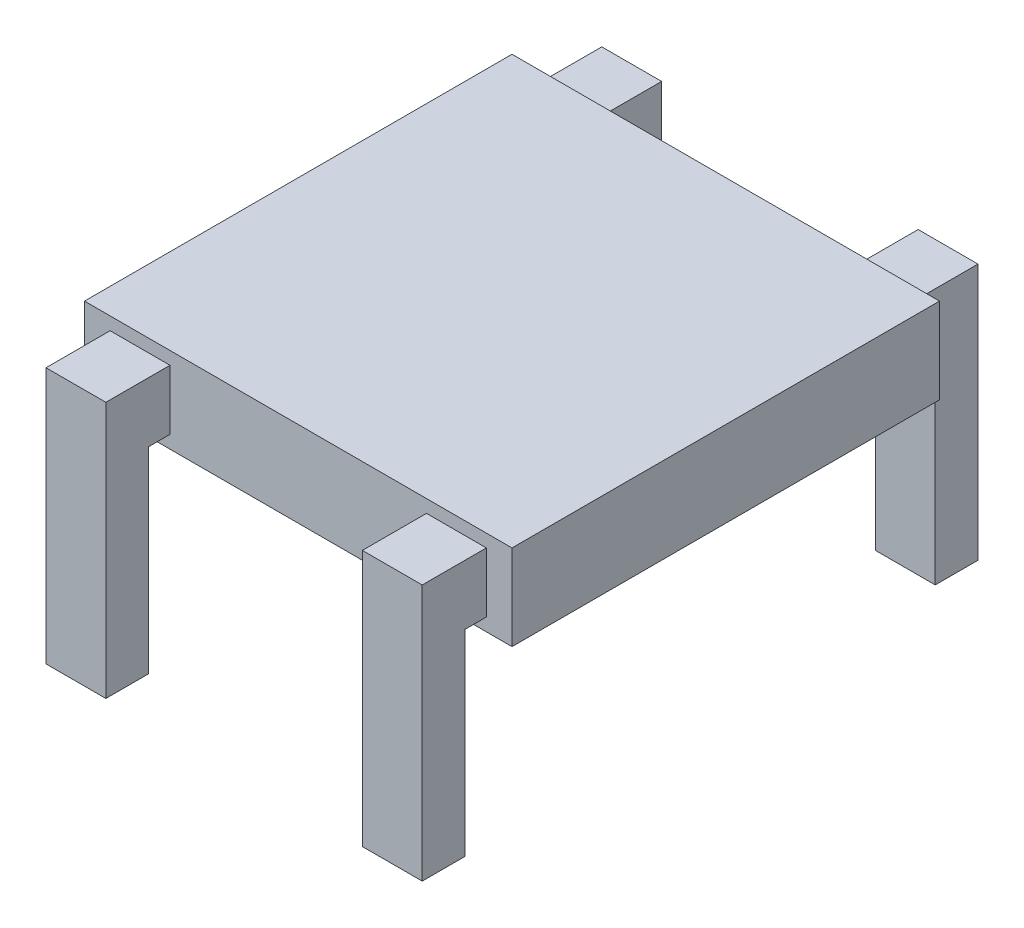
ISO-10303-21;
HEADER;
FILE_DESCRIPTION(('STEP AP214'),'2;1');
FILE_NAME('part.step','',(''),(''),'','','');
FILE_SCHEMA(('AUTOMOTIVE_DESIGN { 1 0 10303 214 1 1 1 1 }'));
ENDSEC;
DATA;
#1=APPLICATION_CONTEXT('core data for automotive mechanical design processes');
#2=APPLICATION_PROTOCOL_DEFINITION('international standard','automotive_design',2000,#1);
#3=PRODUCT_CONTEXT('',#1,'mechanical');
#4=PRODUCT('Part','Part','',(#3));
#5=PRODUCT_RELATED_PRODUCT_CATEGORY('part','',(#4));
#6=PRODUCT_DEFINITION_FORMATION('','',#4);
#7=PRODUCT_DEFINITION_CONTEXT('part definition',#1,'design');
#8=PRODUCT_DEFINITION('design','',#6,#7);
#9=PRODUCT_DEFINITION_SHAPE('','',#8);
#10=(LENGTH_UNIT() NAMED_UNIT(*) SI_UNIT(.MILLI.,.METRE.));
#11=(NAMED_UNIT(*) PLANE_ANGLE_UNIT() SI_UNIT($,.RADIAN.));
#12=(NAMED_UNIT(*) SI_UNIT($,.STERADIAN.) SOLID_ANGLE_UNIT());
#13=UNCERTAINTY_MEASURE_WITH_UNIT(LENGTH_MEASURE(1.E-05),#10,'distance_accuracy_value','');
#14=(GEOMETRIC_REPRESENTATION_CONTEXT(3) GLOBAL_UNCERTAINTY_ASSIGNED_CONTEXT((#13)) GLOBAL_UNIT_ASSIGNED_CONTEXT((#10,
#11,#12)) REPRESENTATION_CONTEXT('',''));
#15=CARTESIAN_POINT('',(0.,0.,0.));
#16=DIRECTION('',(0.,0.,1.));
#17=DIRECTION('',(1.,0.,0.));
#18=AXIS2_PLACEMENT_3D('',#15,#16,#17);
#19=CARTESIAN_POINT('',(2.5,1.,-2.5));
#20=DIRECTION('',(0.,0.,1.));
#21=DIRECTION('',(1.,0.,0.));
#22=AXIS2_PLACEMENT_3D('',#19,#20,#21);
#23=PLANE('',#22);
#24=DIRECTION('',(0.,-1.,0.));
#25=VECTOR('',#24,1.);
#26=CARTESIAN_POINT('',(2.2,0.15,-2.5));
#27=LINE('',#26,#25);
#28=CARTESIAN_POINT('',(2.2,0.85,-2.5));
#29=VERTEX_POINT('',#28);
#30=CARTESIAN_POINT('',(2.2,0.15,-2.5));
#31=VERTEX_POINT('',#30);
#32=EDGE_CURVE('E301',#29,#31,#27,.T.);
#33=ORIENTED_EDGE('',*,*,#32,.F.);
#34=DIRECTION('',(1.,0.,0.));
#35=VECTOR('',#34,1.);
#36=CARTESIAN_POINT('',(1.5,0.85,-2.5));
#37=LINE('',#36,#35);
#38=CARTESIAN_POINT('',(1.5,0.85,-2.5));
#39=VERTEX_POINT('',#38);
#40=EDGE_CURVE('E309',#39,#29,#37,.T.);
#41=ORIENTED_EDGE('',*,*,#40,.F.);
#42=DIRECTION('',(0.,1.,0.));
#43=VECTOR('',#42,1.);
#44=CARTESIAN_POINT('',(1.5,0.15,-2.5));
#45=LINE('',#44,#43);
#46=CARTESIAN_POINT('',(1.5,0.15,-2.5));
#47=VERTEX_POINT('',#46);
#48=EDGE_CURVE('E306',#47,#39,#45,.T.);
#49=ORIENTED_EDGE('',*,*,#48,.F.);
#50=DIRECTION('',(-1.,0.,0.));
#51=VECTOR('',#50,1.);
#52=CARTESIAN_POINT('',(1.5,0.15,-2.5));
#53=LINE('',#52,#51);
#54=EDGE_CURVE('E304',#31,#47,#53,.T.);
#55=ORIENTED_EDGE('',*,*,#54,.F.);
#56=EDGE_LOOP('',(#33,#41,#49,#55));
#57=FACE_BOUND('',#56,.T.);
#58=DIRECTION('',(-1.,0.,0.));
#59=VECTOR('',#58,1.);
#60=CARTESIAN_POINT('',(2.5,0.,-2.5));
#61=LINE('',#60,#59);
#62=CARTESIAN_POINT('',(2.5,0.,-2.5));
#63=VERTEX_POINT('',#62);
#64=CARTESIAN_POINT('',(-2.5,0.,-2.5));
#65=VERTEX_POINT('',#64);
#66=EDGE_CURVE('E422',#63,#65,#61,.T.);
#67=ORIENTED_EDGE('',*,*,#66,.T.);
#68=DIRECTION('',(0.,-1.,0.));
#69=VECTOR('',#68,1.);
#70=CARTESIAN_POINT('',(-2.5,1.,-2.5));
#71=LINE('',#70,#69);
#72=CARTESIAN_POINT('',(-2.5,1.,-2.5));
#73=VERTEX_POINT('',#72);
#74=EDGE_CURVE('E428',#73,#65,#71,.T.);
#75=ORIENTED_EDGE('',*,*,#74,.F.);
#76=DIRECTION('',(-1.,0.,0.));
#77=VECTOR('',#76,1.);
#78=CARTESIAN_POINT('',(2.5,1.,-2.5));
#79=LINE('',#78,#77);
#80=CARTESIAN_POINT('',(2.5,1.,-2.5));
#81=VERTEX_POINT('',#80);
#82=EDGE_CURVE('E426',#81,#73,#79,.T.);
#83=ORIENTED_EDGE('',*,*,#82,.F.);
#84=DIRECTION('',(0.,-1.,0.));
#85=VECTOR('',#84,1.);
#86=CARTESIAN_POINT('',(2.5,1.,-2.5));
#87=LINE('',#86,#85);
#88=EDGE_CURVE('E438',#81,#63,#87,.T.);
#89=ORIENTED_EDGE('',*,*,#88,.T.);
#90=EDGE_LOOP('',(#67,#75,#83,#89));
#91=FACE_BOUND('',#90,.T.);
#92=DIRECTION('',(-1.,0.,0.));
#93=VECTOR('',#92,1.);
#94=CARTESIAN_POINT('',(-1.5,0.15,-2.5));
#95=LINE('',#94,#93);
#96=CARTESIAN_POINT('',(-1.5,0.15,-2.5));
#97=VERTEX_POINT('',#96);
#98=CARTESIAN_POINT('',(-2.2,0.15,-2.5));
#99=VERTEX_POINT('',#98);
#100=EDGE_CURVE('E281',#97,#99,#95,.T.);
#101=ORIENTED_EDGE('',*,*,#100,.F.);
#102=DIRECTION('',(0.,-1.,0.));
#103=VECTOR('',#102,1.);
#104=CARTESIAN_POINT('',(-1.5,0.15,-2.5));
#105=LINE('',#104,#103);
#106=CARTESIAN_POINT('',(-1.5,0.85,-2.5));
#107=VERTEX_POINT('',#106);
#108=EDGE_CURVE('E290',#107,#97,#105,.T.);
#109=ORIENTED_EDGE('',*,*,#108,.F.);
#110=DIRECTION('',(1.,0.,0.));
#111=VECTOR('',#110,1.);
#112=CARTESIAN_POINT('',(-1.5,0.85,-2.5));
#113=LINE('',#112,#111);
#114=CARTESIAN_POINT('',(-2.2,0.85,-2.5));
#115=VERTEX_POINT('',#114);
#116=EDGE_CURVE('E287',#115,#107,#113,.T.);
#117=ORIENTED_EDGE('',*,*,#116,.F.);
#118=DIRECTION('',(0.,1.,0.));
#119=VECTOR('',#118,1.);
#120=CARTESIAN_POINT('',(-2.2,0.15,-2.5));
#121=LINE('',#120,#119);
#122=EDGE_CURVE('E284',#99,#115,#121,.T.);
#123=ORIENTED_EDGE('',*,*,#122,.F.);
#124=EDGE_LOOP('',(#101,#109,#117,#123));
#125=FACE_BOUND('',#124,.T.);
#126=ADVANCED_FACE('F33',(#57,#91,#125),#23,.F.);
#127=CARTESIAN_POINT('',(2.5,1.,2.5));
#128=DIRECTION('',(0.,0.,-1.));
#129=DIRECTION('',(-1.,0.,0.));
#130=AXIS2_PLACEMENT_3D('',#127,#128,#129);
#131=PLANE('',#130);
#132=DIRECTION('',(0.,-1.,0.));
#133=VECTOR('',#132,1.);
#134=CARTESIAN_POINT('',(-2.2,0.15,2.5));
#135=LINE('',#134,#133);
#136=CARTESIAN_POINT('',(-2.2,0.85,2.5));
#137=VERTEX_POINT('',#136);
#138=CARTESIAN_POINT('',(-2.2,0.15,2.5));
#139=VERTEX_POINT('',#138);
#140=EDGE_CURVE('E397',#137,#139,#135,.T.);
#141=ORIENTED_EDGE('',*,*,#140,.F.);
#142=DIRECTION('',(-1.,0.,0.));
#143=VECTOR('',#142,1.);
#144=CARTESIAN_POINT('',(-1.5,0.85,2.5));
#145=LINE('',#144,#143);
#146=CARTESIAN_POINT('',(-1.5,0.85,2.5));
#147=VERTEX_POINT('',#146);
#148=EDGE_CURVE('E406',#147,#137,#145,.T.);
#149=ORIENTED_EDGE('',*,*,#148,.F.);
#150=DIRECTION('',(0.,1.,0.));
#151=VECTOR('',#150,1.);
#152=CARTESIAN_POINT('',(-1.5,0.15,2.5));
#153=LINE('',#152,#151);
#154=CARTESIAN_POINT('',(-1.5,0.15,2.5));
#155=VERTEX_POINT('',#154);
#156=EDGE_CURVE('E403',#155,#147,#153,.T.);
#157=ORIENTED_EDGE('',*,*,#156,.F.);
#158=DIRECTION('',(1.,0.,0.));
#159=VECTOR('',#158,1.);
#160=CARTESIAN_POINT('',(-1.5,0.15,2.5));
#161=LINE('',#160,#159);
#162=EDGE_CURVE('E400',#139,#155,#161,.T.);
#163=ORIENTED_EDGE('',*,*,#162,.F.);
#164=EDGE_LOOP('',(#141,#149,#157,#163));
#165=FACE_BOUND('',#164,.T.);
#166=DIRECTION('',(1.,0.,0.));
#167=VECTOR('',#166,1.);
#168=CARTESIAN_POINT('',(2.5,0.,2.5));
#169=LINE('',#168,#167);
#170=CARTESIAN_POINT('',(-2.5,0.,2.5));
#171=VERTEX_POINT('',#170);
#172=CARTESIAN_POINT('',(2.5,0.,2.5));
#173=VERTEX_POINT('',#172);
#174=EDGE_CURVE('E431',#171,#173,#169,.T.);
#175=ORIENTED_EDGE('',*,*,#174,.T.);
#176=DIRECTION('',(0.,-1.,0.));
#177=VECTOR('',#176,1.);
#178=CARTESIAN_POINT('',(2.5,1.,2.5));
#179=LINE('',#178,#177);
#180=CARTESIAN_POINT('',(2.5,1.,2.5));
#181=VERTEX_POINT('',#180);
#182=EDGE_CURVE('E41',#181,#173,#179,.T.);
#183=ORIENTED_EDGE('',*,*,#182,.F.);
#184=DIRECTION('',(1.,0.,0.));
#185=VECTOR('',#184,1.);
#186=CARTESIAN_POINT('',(2.5,1.,2.5));
#187=LINE('',#186,#185);
#188=CARTESIAN_POINT('',(-2.5,1.,2.5));
#189=VERTEX_POINT('',#188);
#190=EDGE_CURVE('E421',#189,#181,#187,.T.);
#191=ORIENTED_EDGE('',*,*,#190,.F.);
#192=DIRECTION('',(0.,-1.,0.));
#193=VECTOR('',#192,1.);
#194=CARTESIAN_POINT('',(-2.5,1.,2.5));
#195=LINE('',#194,#193);
#196=EDGE_CURVE('E11',#189,#171,#195,.T.);
#197=ORIENTED_EDGE('',*,*,#196,.T.);
#198=EDGE_LOOP('',(#175,#183,#191,#197));
#199=FACE_BOUND('',#198,.T.);
#200=DIRECTION('',(1.,0.,0.));
#201=VECTOR('',#200,1.);
#202=CARTESIAN_POINT('',(1.5,0.15,2.5));
#203=LINE('',#202,#201);
#204=CARTESIAN_POINT('',(1.5,0.15,2.5));
#205=VERTEX_POINT('',#204);
#206=CARTESIAN_POINT('',(2.2,0.15,2.5));
#207=VERTEX_POINT('',#206);
#208=EDGE_CURVE('E377',#205,#207,#203,.T.);
#209=ORIENTED_EDGE('',*,*,#208,.F.);
#210=DIRECTION('',(0.,-1.,0.));
#211=VECTOR('',#210,1.);
#212=CARTESIAN_POINT('',(1.5,0.15,2.5));
#213=LINE('',#212,#211);
#214=CARTESIAN_POINT('',(1.5,0.85,2.5));
#215=VERTEX_POINT('',#214);
#216=EDGE_CURVE('E386',#215,#205,#213,.T.);
#217=ORIENTED_EDGE('',*,*,#216,.F.);
#218=DIRECTION('',(-1.,0.,0.));
#219=VECTOR('',#218,1.);
#220=CARTESIAN_POINT('',(1.5,0.85,2.5));
#221=LINE('',#220,#219);
#222=CARTESIAN_POINT('',(2.2,0.85,2.5));
#223=VERTEX_POINT('',#222);
#224=EDGE_CURVE('E383',#223,#215,#221,.T.);
#225=ORIENTED_EDGE('',*,*,#224,.F.);
#226=DIRECTION('',(0.,1.,0.));
#227=VECTOR('',#226,1.);
#228=CARTESIAN_POINT('',(2.2,0.15,2.5));
#229=LINE('',#228,#227);
#230=EDGE_CURVE('E380',#207,#223,#229,.T.);
#231=ORIENTED_EDGE('',*,*,#230,.F.);
#232=EDGE_LOOP('',(#209,#217,#225,#231));
#233=FACE_BOUND('',#232,.T.);
#234=ADVANCED_FACE('F461',(#165,#199,#233),#131,.F.);
#235=CARTESIAN_POINT('',(-2.5,1.,2.5));
#236=DIRECTION('',(1.,0.,0.));
#237=DIRECTION('',(0.,0.,-1.));
#238=AXIS2_PLACEMENT_3D('',#235,#236,#237);
#239=PLANE('',#238);
#240=DIRECTION('',(0.,0.,1.));
#241=VECTOR('',#240,1.);
#242=CARTESIAN_POINT('',(-2.5,0.,2.5));
#243=LINE('',#242,#241);
#244=EDGE_CURVE('E417',#65,#171,#243,.T.);
#245=ORIENTED_EDGE('',*,*,#244,.T.);
#246=ORIENTED_EDGE('',*,*,#196,.F.);
#247=DIRECTION('',(0.,0.,1.));
#248=VECTOR('',#247,1.);
#249=CARTESIAN_POINT('',(-2.5,1.,2.5));
#250=LINE('',#249,#248);
#251=EDGE_CURVE('E418',#73,#189,#250,.T.);
#252=ORIENTED_EDGE('',*,*,#251,.F.);
#253=ORIENTED_EDGE('',*,*,#74,.T.);
#254=EDGE_LOOP('',(#245,#246,#252,#253));
#255=FACE_BOUND('',#254,.T.);
#256=ADVANCED_FACE('F35',(#255),#239,.F.);
#257=CARTESIAN_POINT('',(2.5,1.,2.5));
#258=DIRECTION('',(-1.,0.,0.));
#259=DIRECTION('',(0.,0.,1.));
#260=AXIS2_PLACEMENT_3D('',#257,#258,#259);
#261=PLANE('',#260);
#262=DIRECTION('',(0.,0.,-1.));
#263=VECTOR('',#262,1.);
#264=CARTESIAN_POINT('',(2.5,0.,2.5));
#265=LINE('',#264,#263);
#266=EDGE_CURVE('E433',#173,#63,#265,.T.);
#267=ORIENTED_EDGE('',*,*,#266,.T.);
#268=ORIENTED_EDGE('',*,*,#88,.F.);
#269=DIRECTION('',(0.,0.,-1.));
#270=VECTOR('',#269,1.);
#271=CARTESIAN_POINT('',(2.5,1.,2.5));
#272=LINE('',#271,#270);
#273=EDGE_CURVE('E424',#181,#81,#272,.T.);
#274=ORIENTED_EDGE('',*,*,#273,.F.);
#275=ORIENTED_EDGE('',*,*,#182,.T.);
#276=EDGE_LOOP('',(#267,#268,#274,#275));
#277=FACE_BOUND('',#276,.T.);
#278=ADVANCED_FACE('F445',(#277),#261,.F.);
#279=CARTESIAN_POINT('',(0.,1.,0.));
#280=DIRECTION('',(0.,1.,0.));
#281=DIRECTION('',(0.,0.,1.));
#282=AXIS2_PLACEMENT_3D('',#279,#280,#281);
#283=PLANE('',#282);
#284=ORIENTED_EDGE('',*,*,#251,.T.);
#285=ORIENTED_EDGE('',*,*,#190,.T.);
#286=ORIENTED_EDGE('',*,*,#273,.T.);
#287=ORIENTED_EDGE('',*,*,#82,.T.);
#288=EDGE_LOOP('',(#284,#285,#286,#287));
#289=FACE_BOUND('',#288,.T.);
#290=ADVANCED_FACE('F460',(#289),#283,.T.);
#291=CARTESIAN_POINT('',(0.,0.,0.));
#292=DIRECTION('',(0.,1.,0.));
#293=DIRECTION('',(0.,0.,1.));
#294=AXIS2_PLACEMENT_3D('',#291,#292,#293);
#295=PLANE('',#294);
#296=ORIENTED_EDGE('',*,*,#244,.F.);
#297=ORIENTED_EDGE('',*,*,#66,.F.);
#298=ORIENTED_EDGE('',*,*,#266,.F.);
#299=ORIENTED_EDGE('',*,*,#174,.F.);
#300=EDGE_LOOP('',(#296,#297,#298,#299));
#301=FACE_BOUND('',#300,.T.);
#302=ADVANCED_FACE('F451',(#301),#295,.F.);
#303=CARTESIAN_POINT('',(-2.2,0.15,3.));
#304=DIRECTION('',(1.,0.,0.));
#305=DIRECTION('',(0.,0.,-1.));
#306=AXIS2_PLACEMENT_3D('',#303,#304,#305);
#307=PLANE('',#306);
#308=DIRECTION('',(0.,0.,-1.));
#309=VECTOR('',#308,1.);
#310=CARTESIAN_POINT('',(-2.2,0.15,3.));
#311=LINE('',#310,#309);
#312=CARTESIAN_POINT('',(-2.2,0.15,2.75));
#313=VERTEX_POINT('',#312);
#314=EDGE_CURVE('E415',#313,#139,#311,.T.);
#315=ORIENTED_EDGE('',*,*,#314,.F.);
#316=DIRECTION('',(0.,1.,0.));
#317=VECTOR('',#316,1.);
#318=CARTESIAN_POINT('',(-2.2,-2.15,2.75));
#319=LINE('',#318,#317);
#320=CARTESIAN_POINT('',(-2.2,-2.15,2.75));
#321=VERTEX_POINT('',#320);
#322=EDGE_CURVE('E364',#321,#313,#319,.T.);
#323=ORIENTED_EDGE('',*,*,#322,.F.);
#324=DIRECTION('',(0.,0.,1.));
#325=VECTOR('',#324,1.);
#326=CARTESIAN_POINT('',(-2.2,-2.15,3.25));
#327=LINE('',#326,#325);
#328=CARTESIAN_POINT('',(-2.2,-2.15,3.25));
#329=VERTEX_POINT('',#328);
#330=EDGE_CURVE('E349',#321,#329,#327,.T.);
#331=ORIENTED_EDGE('',*,*,#330,.T.);
#332=DIRECTION('',(0.,1.,0.));
#333=VECTOR('',#332,1.);
#334=CARTESIAN_POINT('',(-2.2,-2.15,3.25));
#335=LINE('',#334,#333);
#336=CARTESIAN_POINT('',(-2.2,0.85,3.25));
#337=VERTEX_POINT('',#336);
#338=EDGE_CURVE('E361',#329,#337,#335,.T.);
#339=ORIENTED_EDGE('',*,*,#338,.T.);
#340=DIRECTION('',(0.,0.,-1.));
#341=VECTOR('',#340,1.);
#342=CARTESIAN_POINT('',(-2.2,0.85,3.));
#343=LINE('',#342,#341);
#344=EDGE_CURVE('E409',#337,#137,#343,.T.);
#345=ORIENTED_EDGE('',*,*,#344,.T.);
#346=ORIENTED_EDGE('',*,*,#140,.T.);
#347=EDGE_LOOP('',(#315,#323,#331,#339,#345,#346));
#348=FACE_BOUND('',#347,.T.);
#349=ADVANCED_FACE('F532',(#348),#307,.F.);
#350=CARTESIAN_POINT('',(-1.5,0.15,3.));
#351=DIRECTION('',(0.,1.,0.));
#352=DIRECTION('',(-1.,0.,0.));
#353=AXIS2_PLACEMENT_3D('',#350,#351,#352);
#354=PLANE('',#353);
#355=DIRECTION('',(0.,0.,-1.));
#356=VECTOR('',#355,1.);
#357=CARTESIAN_POINT('',(-1.5,0.15,3.));
#358=LINE('',#357,#356);
#359=CARTESIAN_POINT('',(-1.5,0.15,2.75));
#360=VERTEX_POINT('',#359);
#361=EDGE_CURVE('E413',#360,#155,#358,.T.);
#362=ORIENTED_EDGE('',*,*,#361,.F.);
#363=DIRECTION('',(-1.,0.,0.));
#364=VECTOR('',#363,1.);
#365=CARTESIAN_POINT('',(-1.5,0.15,2.75));
#366=LINE('',#365,#364);
#367=EDGE_CURVE('E367',#360,#313,#366,.T.);
#368=ORIENTED_EDGE('',*,*,#367,.T.);
#369=ORIENTED_EDGE('',*,*,#314,.T.);
#370=ORIENTED_EDGE('',*,*,#162,.T.);
#371=EDGE_LOOP('',(#362,#368,#369,#370));
#372=FACE_BOUND('',#371,.T.);
#373=ADVANCED_FACE('F537',(#372),#354,.F.);
#374=CARTESIAN_POINT('',(-1.5,0.15,3.));
#375=DIRECTION('',(-1.,0.,0.));
#376=DIRECTION('',(0.,0.,1.));
#377=AXIS2_PLACEMENT_3D('',#374,#375,#376);
#378=PLANE('',#377);
#379=DIRECTION('',(0.,1.,0.));
#380=VECTOR('',#379,1.);
#381=CARTESIAN_POINT('',(-1.5,-2.15,2.75));
#382=LINE('',#381,#380);
#383=CARTESIAN_POINT('',(-1.5,-2.15,2.75));
#384=VERTEX_POINT('',#383);
#385=EDGE_CURVE('E368',#384,#360,#382,.T.);
#386=ORIENTED_EDGE('',*,*,#385,.T.);
#387=ORIENTED_EDGE('',*,*,#361,.T.);
#388=ORIENTED_EDGE('',*,*,#156,.T.);
#389=DIRECTION('',(0.,0.,-1.));
#390=VECTOR('',#389,1.);
#391=CARTESIAN_POINT('',(-1.5,0.85,3.));
#392=LINE('',#391,#390);
#393=CARTESIAN_POINT('',(-1.5,0.85,3.25));
#394=VERTEX_POINT('',#393);
#395=EDGE_CURVE('E411',#394,#147,#392,.T.);
#396=ORIENTED_EDGE('',*,*,#395,.F.);
#397=DIRECTION('',(0.,1.,0.));
#398=VECTOR('',#397,1.);
#399=CARTESIAN_POINT('',(-1.5,-2.15,3.25));
#400=LINE('',#399,#398);
#401=CARTESIAN_POINT('',(-1.5,-2.15,3.25));
#402=VERTEX_POINT('',#401);
#403=EDGE_CURVE('E371',#402,#394,#400,.T.);
#404=ORIENTED_EDGE('',*,*,#403,.F.);
#405=DIRECTION('',(0.,0.,-1.));
#406=VECTOR('',#405,1.);
#407=CARTESIAN_POINT('',(-1.5,-2.15,3.25));
#408=LINE('',#407,#406);
#409=EDGE_CURVE('E355',#402,#384,#408,.T.);
#410=ORIENTED_EDGE('',*,*,#409,.T.);
#411=EDGE_LOOP('',(#386,#387,#388,#396,#404,#410));
#412=FACE_BOUND('',#411,.T.);
#413=ADVANCED_FACE('F549',(#412),#378,.F.);
#414=CARTESIAN_POINT('',(-1.5,0.85,3.));
#415=DIRECTION('',(0.,-1.,0.));
#416=DIRECTION('',(0.,0.,-1.));
#417=AXIS2_PLACEMENT_3D('',#414,#415,#416);
#418=PLANE('',#417);
#419=ORIENTED_EDGE('',*,*,#148,.T.);
#420=ORIENTED_EDGE('',*,*,#344,.F.);
#421=DIRECTION('',(1.,0.,0.));
#422=VECTOR('',#421,1.);
#423=CARTESIAN_POINT('',(-1.5,0.85,3.25));
#424=LINE('',#423,#422);
#425=EDGE_CURVE('E348',#337,#394,#424,.T.);
#426=ORIENTED_EDGE('',*,*,#425,.T.);
#427=ORIENTED_EDGE('',*,*,#395,.T.);
#428=EDGE_LOOP('',(#419,#420,#426,#427));
#429=FACE_BOUND('',#428,.T.);
#430=ADVANCED_FACE('F559',(#429),#418,.F.);
#431=CARTESIAN_POINT('',(1.5,0.15,3.));
#432=DIRECTION('',(0.,1.,0.));
#433=DIRECTION('',(-1.,0.,0.));
#434=AXIS2_PLACEMENT_3D('',#431,#432,#433);
#435=PLANE('',#434);
#436=DIRECTION('',(0.,0.,-1.));
#437=VECTOR('',#436,1.);
#438=CARTESIAN_POINT('',(2.2,0.15,3.));
#439=LINE('',#438,#437);
#440=CARTESIAN_POINT('',(2.2,0.15,2.75));
#441=VERTEX_POINT('',#440);
#442=EDGE_CURVE('E395',#441,#207,#439,.T.);
#443=ORIENTED_EDGE('',*,*,#442,.F.);
#444=DIRECTION('',(-1.,0.,0.));
#445=VECTOR('',#444,1.);
#446=CARTESIAN_POINT('',(1.5,0.15,2.75));
#447=LINE('',#446,#445);
#448=CARTESIAN_POINT('',(1.5,0.15,2.75));
#449=VERTEX_POINT('',#448);
#450=EDGE_CURVE('E338',#441,#449,#447,.T.);
#451=ORIENTED_EDGE('',*,*,#450,.T.);
#452=DIRECTION('',(0.,0.,-1.));
#453=VECTOR('',#452,1.);
#454=CARTESIAN_POINT('',(1.5,0.15,3.));
#455=LINE('',#454,#453);
#456=EDGE_CURVE('E389',#449,#205,#455,.T.);
#457=ORIENTED_EDGE('',*,*,#456,.T.);
#458=ORIENTED_EDGE('',*,*,#208,.T.);
#459=EDGE_LOOP('',(#443,#451,#457,#458));
#460=FACE_BOUND('',#459,.T.);
#461=ADVANCED_FACE('F479',(#460),#435,.F.);
#462=CARTESIAN_POINT('',(2.2,0.15,3.));
#463=DIRECTION('',(-1.,0.,0.));
#464=DIRECTION('',(0.,0.,1.));
#465=AXIS2_PLACEMENT_3D('',#462,#463,#464);
#466=PLANE('',#465);
#467=DIRECTION('',(0.,1.,0.));
#468=VECTOR('',#467,1.);
#469=CARTESIAN_POINT('',(2.2,-2.15,2.75));
#470=LINE('',#469,#468);
#471=CARTESIAN_POINT('',(2.2,-2.15,2.75));
#472=VERTEX_POINT('',#471);
#473=EDGE_CURVE('E339',#472,#441,#470,.T.);
#474=ORIENTED_EDGE('',*,*,#473,.T.);
#475=ORIENTED_EDGE('',*,*,#442,.T.);
#476=ORIENTED_EDGE('',*,*,#230,.T.);
#477=DIRECTION('',(0.,0.,-1.));
#478=VECTOR('',#477,1.);
#479=CARTESIAN_POINT('',(2.2,0.85,3.));
#480=LINE('',#479,#478);
#481=CARTESIAN_POINT('',(2.2,0.85,3.25));
#482=VERTEX_POINT('',#481);
#483=EDGE_CURVE('E393',#482,#223,#480,.T.);
#484=ORIENTED_EDGE('',*,*,#483,.F.);
#485=DIRECTION('',(0.,1.,0.));
#486=VECTOR('',#485,1.);
#487=CARTESIAN_POINT('',(2.2,-2.15,3.25));
#488=LINE('',#487,#486);
#489=CARTESIAN_POINT('',(2.2,-2.15,3.25));
#490=VERTEX_POINT('',#489);
#491=EDGE_CURVE('E342',#490,#482,#488,.T.);
#492=ORIENTED_EDGE('',*,*,#491,.F.);
#493=DIRECTION('',(0.,0.,-1.));
#494=VECTOR('',#493,1.);
#495=CARTESIAN_POINT('',(2.2,-2.15,3.25));
#496=LINE('',#495,#494);
#497=EDGE_CURVE('E326',#490,#472,#496,.T.);
#498=ORIENTED_EDGE('',*,*,#497,.T.);
#499=EDGE_LOOP('',(#474,#475,#476,#484,#492,#498));
#500=FACE_BOUND('',#499,.T.);
#501=ADVANCED_FACE('F477',(#500),#466,.F.);
#502=CARTESIAN_POINT('',(1.5,0.85,3.));
#503=DIRECTION('',(0.,-1.,0.));
#504=DIRECTION('',(0.,0.,-1.));
#505=AXIS2_PLACEMENT_3D('',#502,#503,#504);
#506=PLANE('',#505);
#507=ORIENTED_EDGE('',*,*,#224,.T.);
#508=DIRECTION('',(0.,0.,-1.));
#509=VECTOR('',#508,1.);
#510=CARTESIAN_POINT('',(1.5,0.85,3.));
#511=LINE('',#510,#509);
#512=CARTESIAN_POINT('',(1.5,0.85,3.25));
#513=VERTEX_POINT('',#512);
#514=EDGE_CURVE('E391',#513,#215,#511,.T.);
#515=ORIENTED_EDGE('',*,*,#514,.F.);
#516=DIRECTION('',(1.,0.,0.));
#517=VECTOR('',#516,1.);
#518=CARTESIAN_POINT('',(2.2,0.85,3.25));
#519=LINE('',#518,#517);
#520=EDGE_CURVE('E319',#513,#482,#519,.T.);
#521=ORIENTED_EDGE('',*,*,#520,.T.);
#522=ORIENTED_EDGE('',*,*,#483,.T.);
#523=EDGE_LOOP('',(#507,#515,#521,#522));
#524=FACE_BOUND('',#523,.T.);
#525=ADVANCED_FACE('F475',(#524),#506,.F.);
#526=CARTESIAN_POINT('',(1.5,0.15,3.));
#527=DIRECTION('',(1.,0.,0.));
#528=DIRECTION('',(0.,0.,-1.));
#529=AXIS2_PLACEMENT_3D('',#526,#527,#528);
#530=PLANE('',#529);
#531=ORIENTED_EDGE('',*,*,#456,.F.);
#532=DIRECTION('',(0.,1.,0.));
#533=VECTOR('',#532,1.);
#534=CARTESIAN_POINT('',(1.5,-2.15,2.75));
#535=LINE('',#534,#533);
#536=CARTESIAN_POINT('',(1.5,-2.15,2.75));
#537=VERTEX_POINT('',#536);
#538=EDGE_CURVE('E335',#537,#449,#535,.T.);
#539=ORIENTED_EDGE('',*,*,#538,.F.);
#540=DIRECTION('',(0.,0.,1.));
#541=VECTOR('',#540,1.);
#542=CARTESIAN_POINT('',(1.5,-2.15,3.25));
#543=LINE('',#542,#541);
#544=CARTESIAN_POINT('',(1.5,-2.15,3.25));
#545=VERTEX_POINT('',#544);
#546=EDGE_CURVE('E320',#537,#545,#543,.T.);
#547=ORIENTED_EDGE('',*,*,#546,.T.);
#548=DIRECTION('',(0.,1.,0.));
#549=VECTOR('',#548,1.);
#550=CARTESIAN_POINT('',(1.5,-2.15,3.25));
#551=LINE('',#550,#549);
#552=EDGE_CURVE('E332',#545,#513,#551,.T.);
#553=ORIENTED_EDGE('',*,*,#552,.T.);
#554=ORIENTED_EDGE('',*,*,#514,.T.);
#555=ORIENTED_EDGE('',*,*,#216,.T.);
#556=EDGE_LOOP('',(#531,#539,#547,#553,#554,#555));
#557=FACE_BOUND('',#556,.T.);
#558=ADVANCED_FACE('F472',(#557),#530,.F.);
#559=CARTESIAN_POINT('',(-1.5,-2.15,2.75));
#560=DIRECTION('',(0.,0.,-1.));
#561=DIRECTION('',(-1.,0.,0.));
#562=AXIS2_PLACEMENT_3D('',#559,#560,#561);
#563=PLANE('',#562);
#564=ORIENTED_EDGE('',*,*,#367,.F.);
#565=ORIENTED_EDGE('',*,*,#385,.F.);
#566=DIRECTION('',(-1.,0.,0.));
#567=VECTOR('',#566,1.);
#568=CARTESIAN_POINT('',(-1.5,-2.15,2.75));
#569=LINE('',#568,#567);
#570=EDGE_CURVE('E358',#384,#321,#569,.T.);
#571=ORIENTED_EDGE('',*,*,#570,.T.);
#572=ORIENTED_EDGE('',*,*,#322,.T.);
#573=EDGE_LOOP('',(#564,#565,#571,#572));
#574=FACE_BOUND('',#573,.T.);
#575=ADVANCED_FACE('F605',(#574),#563,.T.);
#576=CARTESIAN_POINT('',(-1.5,-2.15,3.25));
#577=DIRECTION('',(0.,0.,1.));
#578=DIRECTION('',(1.,0.,0.));
#579=AXIS2_PLACEMENT_3D('',#576,#577,#578);
#580=PLANE('',#579);
#581=ORIENTED_EDGE('',*,*,#425,.F.);
#582=ORIENTED_EDGE('',*,*,#338,.F.);
#583=DIRECTION('',(1.,0.,0.));
#584=VECTOR('',#583,1.);
#585=CARTESIAN_POINT('',(-1.5,-2.15,3.25));
#586=LINE('',#585,#584);
#587=EDGE_CURVE('E352',#329,#402,#586,.T.);
#588=ORIENTED_EDGE('',*,*,#587,.T.);
#589=ORIENTED_EDGE('',*,*,#403,.T.);
#590=EDGE_LOOP('',(#581,#582,#588,#589));
#591=FACE_BOUND('',#590,.T.);
#592=ADVANCED_FACE('F614',(#591),#580,.T.);
#593=CARTESIAN_POINT('',(0.,-2.15,0.));
#594=DIRECTION('',(0.,1.,0.));
#595=DIRECTION('',(0.,0.,1.));
#596=AXIS2_PLACEMENT_3D('',#593,#594,#595);
#597=PLANE('',#596);
#598=ORIENTED_EDGE('',*,*,#330,.F.);
#599=ORIENTED_EDGE('',*,*,#570,.F.);
#600=ORIENTED_EDGE('',*,*,#409,.F.);
#601=ORIENTED_EDGE('',*,*,#587,.F.);
#602=EDGE_LOOP('',(#598,#599,#600,#601));
#603=FACE_BOUND('',#602,.T.);
#604=ADVANCED_FACE('F498',(#603),#597,.F.);
#605=CARTESIAN_POINT('',(2.2,-2.15,2.75));
#606=DIRECTION('',(0.,0.,-1.));
#607=DIRECTION('',(-1.,0.,0.));
#608=AXIS2_PLACEMENT_3D('',#605,#606,#607);
#609=PLANE('',#608);
#610=ORIENTED_EDGE('',*,*,#450,.F.);
#611=ORIENTED_EDGE('',*,*,#473,.F.);
#612=DIRECTION('',(-1.,0.,0.));
#613=VECTOR('',#612,1.);
#614=CARTESIAN_POINT('',(2.2,-2.15,2.75));
#615=LINE('',#614,#613);
#616=EDGE_CURVE('E329',#472,#537,#615,.T.);
#617=ORIENTED_EDGE('',*,*,#616,.T.);
#618=ORIENTED_EDGE('',*,*,#538,.T.);
#619=EDGE_LOOP('',(#610,#611,#617,#618));
#620=FACE_BOUND('',#619,.T.);
#621=ADVANCED_FACE('F481',(#620),#609,.T.);
#622=CARTESIAN_POINT('',(2.2,-2.15,3.25));
#623=DIRECTION('',(0.,0.,1.));
#624=DIRECTION('',(1.,0.,0.));
#625=AXIS2_PLACEMENT_3D('',#622,#623,#624);
#626=PLANE('',#625);
#627=ORIENTED_EDGE('',*,*,#520,.F.);
#628=ORIENTED_EDGE('',*,*,#552,.F.);
#629=DIRECTION('',(1.,0.,0.));
#630=VECTOR('',#629,1.);
#631=CARTESIAN_POINT('',(2.2,-2.15,3.25));
#632=LINE('',#631,#630);
#633=EDGE_CURVE('E323',#545,#490,#632,.T.);
#634=ORIENTED_EDGE('',*,*,#633,.T.);
#635=ORIENTED_EDGE('',*,*,#491,.T.);
#636=EDGE_LOOP('',(#627,#628,#634,#635));
#637=FACE_BOUND('',#636,.T.);
#638=ADVANCED_FACE('F489',(#637),#626,.T.);
#639=CARTESIAN_POINT('',(0.,-2.15,0.));
#640=DIRECTION('',(0.,1.,0.));
#641=DIRECTION('',(0.,0.,1.));
#642=AXIS2_PLACEMENT_3D('',#639,#640,#641);
#643=PLANE('',#642);
#644=ORIENTED_EDGE('',*,*,#546,.F.);
#645=ORIENTED_EDGE('',*,*,#616,.F.);
#646=ORIENTED_EDGE('',*,*,#497,.F.);
#647=ORIENTED_EDGE('',*,*,#633,.F.);
#648=EDGE_LOOP('',(#644,#645,#646,#647));
#649=FACE_BOUND('',#648,.T.);
#650=ADVANCED_FACE('F486',(#649),#643,.F.);
#651=CARTESIAN_POINT('',(2.2,0.15,-3.));
#652=DIRECTION('',(-1.,0.,0.));
#653=DIRECTION('',(0.,0.,1.));
#654=AXIS2_PLACEMENT_3D('',#651,#652,#653);
#655=PLANE('',#654);
#656=DIRECTION('',(0.,0.,1.));
#657=VECTOR('',#656,1.);
#658=CARTESIAN_POINT('',(2.2,0.15,-3.));
#659=LINE('',#658,#657);
#660=CARTESIAN_POINT('',(2.2,0.15,-2.75));
#661=VERTEX_POINT('',#660);
#662=EDGE_CURVE('E317',#661,#31,#659,.T.);
#663=ORIENTED_EDGE('',*,*,#662,.F.);
#664=DIRECTION('',(0.,1.,0.));
#665=VECTOR('',#664,1.);
#666=CARTESIAN_POINT('',(2.2,-2.15,-2.75));
#667=LINE('',#666,#665);
#668=CARTESIAN_POINT('',(2.2,-2.15,-2.75));
#669=VERTEX_POINT('',#668);
#670=EDGE_CURVE('E223',#669,#661,#667,.T.);
#671=ORIENTED_EDGE('',*,*,#670,.F.);
#672=DIRECTION('',(0.,0.,-1.));
#673=VECTOR('',#672,1.);
#674=CARTESIAN_POINT('',(2.2,-2.15,-2.75));
#675=LINE('',#674,#673);
#676=CARTESIAN_POINT('',(2.2,-2.15,-3.25));
#677=VERTEX_POINT('',#676);
#678=EDGE_CURVE('E234',#669,#677,#675,.T.);
#679=ORIENTED_EDGE('',*,*,#678,.T.);
#680=DIRECTION('',(0.,1.,0.));
#681=VECTOR('',#680,1.);
#682=CARTESIAN_POINT('',(2.2,-2.15,-3.25));
#683=LINE('',#682,#681);
#684=CARTESIAN_POINT('',(2.2,0.85,-3.25));
#685=VERTEX_POINT('',#684);
#686=EDGE_CURVE('E247',#677,#685,#683,.T.);
#687=ORIENTED_EDGE('',*,*,#686,.T.);
#688=DIRECTION('',(0.,0.,1.));
#689=VECTOR('',#688,1.);
#690=CARTESIAN_POINT('',(2.2,0.85,-3.));
#691=LINE('',#690,#689);
#692=EDGE_CURVE('E312',#685,#29,#691,.T.);
#693=ORIENTED_EDGE('',*,*,#692,.T.);
#694=ORIENTED_EDGE('',*,*,#32,.T.);
#695=EDGE_LOOP('',(#663,#671,#679,#687,#693,#694));
#696=FACE_BOUND('',#695,.T.);
#697=ADVANCED_FACE('F496',(#696),#655,.F.);
#698=CARTESIAN_POINT('',(1.5,0.15,-3.));
#699=DIRECTION('',(0.,1.,0.));
#700=DIRECTION('',(-1.,0.,0.));
#701=AXIS2_PLACEMENT_3D('',#698,#699,#700);
#702=PLANE('',#701);
#703=DIRECTION('',(0.,0.,1.));
#704=VECTOR('',#703,1.);
#705=CARTESIAN_POINT('',(1.5,0.15,-3.));
#706=LINE('',#705,#704);
#707=CARTESIAN_POINT('',(1.5,0.15,-2.75));
#708=VERTEX_POINT('',#707);
#709=EDGE_CURVE('E53',#708,#47,#706,.T.);
#710=ORIENTED_EDGE('',*,*,#709,.F.);
#711=DIRECTION('',(1.,0.,0.));
#712=VECTOR('',#711,1.);
#713=CARTESIAN_POINT('',(1.5,0.15,-2.75));
#714=LINE('',#713,#712);
#715=EDGE_CURVE('E48',#708,#661,#714,.T.);
#716=ORIENTED_EDGE('',*,*,#715,.T.);
#717=ORIENTED_EDGE('',*,*,#662,.T.);
#718=ORIENTED_EDGE('',*,*,#54,.T.);
#719=EDGE_LOOP('',(#710,#716,#717,#718));
#720=FACE_BOUND('',#719,.T.);
#721=ADVANCED_FACE('F662',(#720),#702,.F.);
#722=CARTESIAN_POINT('',(1.5,0.15,-3.));
#723=DIRECTION('',(1.,0.,0.));
#724=DIRECTION('',(0.,0.,-1.));
#725=AXIS2_PLACEMENT_3D('',#722,#723,#724);
#726=PLANE('',#725);
#727=DIRECTION('',(0.,1.,0.));
#728=VECTOR('',#727,1.);
#729=CARTESIAN_POINT('',(1.5,-2.15,-2.75));
#730=LINE('',#729,#728);
#731=CARTESIAN_POINT('',(1.5,-2.15,-2.75));
#732=VERTEX_POINT('',#731);
#733=EDGE_CURVE('E216',#732,#708,#730,.T.);
#734=ORIENTED_EDGE('',*,*,#733,.T.);
#735=ORIENTED_EDGE('',*,*,#709,.T.);
#736=ORIENTED_EDGE('',*,*,#48,.T.);
#737=DIRECTION('',(0.,0.,1.));
#738=VECTOR('',#737,1.);
#739=CARTESIAN_POINT('',(1.5,0.85,-3.));
#740=LINE('',#739,#738);
#741=CARTESIAN_POINT('',(1.5,0.85,-3.25));
#742=VERTEX_POINT('',#741);
#743=EDGE_CURVE('E314',#742,#39,#740,.T.);
#744=ORIENTED_EDGE('',*,*,#743,.F.);
#745=DIRECTION('',(0.,1.,0.));
#746=VECTOR('',#745,1.);
#747=CARTESIAN_POINT('',(1.5,-2.15,-3.25));
#748=LINE('',#747,#746);
#749=CARTESIAN_POINT('',(1.5,-2.15,-3.25));
#750=VERTEX_POINT('',#749);
#751=EDGE_CURVE('E238',#750,#742,#748,.T.);
#752=ORIENTED_EDGE('',*,*,#751,.F.);
#753=DIRECTION('',(0.,0.,1.));
#754=VECTOR('',#753,1.);
#755=CARTESIAN_POINT('',(1.5,-2.15,-2.75));
#756=LINE('',#755,#754);
#757=EDGE_CURVE('E231',#750,#732,#756,.T.);
#758=ORIENTED_EDGE('',*,*,#757,.T.);
#759=EDGE_LOOP('',(#734,#735,#736,#744,#752,#758));
#760=FACE_BOUND('',#759,.T.);
#761=ADVANCED_FACE('F236',(#760),#726,.F.);
#762=CARTESIAN_POINT('',(1.5,0.85,-3.));
#763=DIRECTION('',(0.,-1.,0.));
#764=DIRECTION('',(0.,0.,-1.));
#765=AXIS2_PLACEMENT_3D('',#762,#763,#764);
#766=PLANE('',#765);
#767=ORIENTED_EDGE('',*,*,#40,.T.);
#768=ORIENTED_EDGE('',*,*,#692,.F.);
#769=DIRECTION('',(-1.,0.,0.));
#770=VECTOR('',#769,1.);
#771=CARTESIAN_POINT('',(2.2,0.85,-3.25));
#772=LINE('',#771,#770);
#773=EDGE_CURVE('E239',#685,#742,#772,.T.);
#774=ORIENTED_EDGE('',*,*,#773,.T.);
#775=ORIENTED_EDGE('',*,*,#743,.T.);
#776=EDGE_LOOP('',(#767,#768,#774,#775));
#777=FACE_BOUND('',#776,.T.);
#778=ADVANCED_FACE('F682',(#777),#766,.F.);
#779=CARTESIAN_POINT('',(-1.5,0.15,-3.));
#780=DIRECTION('',(0.,1.,0.));
#781=DIRECTION('',(-1.,0.,0.));
#782=AXIS2_PLACEMENT_3D('',#779,#780,#781);
#783=PLANE('',#782);
#784=DIRECTION('',(0.,0.,1.));
#785=VECTOR('',#784,1.);
#786=CARTESIAN_POINT('',(-2.2,0.15,-3.));
#787=LINE('',#786,#785);
#788=CARTESIAN_POINT('',(-2.2,0.15,-2.75));
#789=VERTEX_POINT('',#788);
#790=EDGE_CURVE('E299',#789,#99,#787,.T.);
#791=ORIENTED_EDGE('',*,*,#790,.F.);
#792=DIRECTION('',(1.,0.,0.));
#793=VECTOR('',#792,1.);
#794=CARTESIAN_POINT('',(-1.5,0.15,-2.75));
#795=LINE('',#794,#793);
#796=CARTESIAN_POINT('',(-1.5,0.15,-2.75));
#797=VERTEX_POINT('',#796);
#798=EDGE_CURVE('E271',#789,#797,#795,.T.);
#799=ORIENTED_EDGE('',*,*,#798,.T.);
#800=DIRECTION('',(0.,0.,1.));
#801=VECTOR('',#800,1.);
#802=CARTESIAN_POINT('',(-1.5,0.15,-3.));
#803=LINE('',#802,#801);
#804=EDGE_CURVE('E293',#797,#97,#803,.T.);
#805=ORIENTED_EDGE('',*,*,#804,.T.);
#806=ORIENTED_EDGE('',*,*,#100,.T.);
#807=EDGE_LOOP('',(#791,#799,#805,#806));
#808=FACE_BOUND('',#807,.T.);
#809=ADVANCED_FACE('F691',(#808),#783,.F.);
#810=CARTESIAN_POINT('',(-2.2,0.15,-3.));
#811=DIRECTION('',(1.,0.,0.));
#812=DIRECTION('',(0.,0.,-1.));
#813=AXIS2_PLACEMENT_3D('',#810,#811,#812);
#814=PLANE('',#813);
#815=DIRECTION('',(0.,1.,0.));
#816=VECTOR('',#815,1.);
#817=CARTESIAN_POINT('',(-2.2,-2.15,-2.75));
#818=LINE('',#817,#816);
#819=CARTESIAN_POINT('',(-2.2,-2.15,-2.75));
#820=VERTEX_POINT('',#819);
#821=EDGE_CURVE('E265',#820,#789,#818,.T.);
#822=ORIENTED_EDGE('',*,*,#821,.T.);
#823=ORIENTED_EDGE('',*,*,#790,.T.);
#824=ORIENTED_EDGE('',*,*,#122,.T.);
#825=DIRECTION('',(0.,0.,1.));
#826=VECTOR('',#825,1.);
#827=CARTESIAN_POINT('',(-2.2,0.85,-3.));
#828=LINE('',#827,#826);
#829=CARTESIAN_POINT('',(-2.2,0.85,-3.25));
#830=VERTEX_POINT('',#829);
#831=EDGE_CURVE('E297',#830,#115,#828,.T.);
#832=ORIENTED_EDGE('',*,*,#831,.F.);
#833=DIRECTION('',(0.,1.,0.));
#834=VECTOR('',#833,1.);
#835=CARTESIAN_POINT('',(-2.2,-2.15,-3.25));
#836=LINE('',#835,#834);
#837=CARTESIAN_POINT('',(-2.2,-2.15,-3.25));
#838=VERTEX_POINT('',#837);
#839=EDGE_CURVE('E268',#838,#830,#836,.T.);
#840=ORIENTED_EDGE('',*,*,#839,.F.);
#841=DIRECTION('',(0.,0.,1.));
#842=VECTOR('',#841,1.);
#843=CARTESIAN_POINT('',(-2.2,-2.15,-2.75));
#844=LINE('',#843,#842);
#845=EDGE_CURVE('E253',#838,#820,#844,.T.);
#846=ORIENTED_EDGE('',*,*,#845,.T.);
#847=EDGE_LOOP('',(#822,#823,#824,#832,#840,#846));
#848=FACE_BOUND('',#847,.T.);
#849=ADVANCED_FACE('F703',(#848),#814,.F.);
#850=CARTESIAN_POINT('',(-1.5,0.85,-3.));
#851=DIRECTION('',(0.,-1.,0.));
#852=DIRECTION('',(0.,0.,-1.));
#853=AXIS2_PLACEMENT_3D('',#850,#851,#852);
#854=PLANE('',#853);
#855=ORIENTED_EDGE('',*,*,#116,.T.);
#856=DIRECTION('',(0.,0.,1.));
#857=VECTOR('',#856,1.);
#858=CARTESIAN_POINT('',(-1.5,0.85,-3.));
#859=LINE('',#858,#857);
#860=CARTESIAN_POINT('',(-1.5,0.85,-3.25));
#861=VERTEX_POINT('',#860);
#862=EDGE_CURVE('E295',#861,#107,#859,.T.);
#863=ORIENTED_EDGE('',*,*,#862,.F.);
#864=DIRECTION('',(-1.,0.,0.));
#865=VECTOR('',#864,1.);
#866=CARTESIAN_POINT('',(-1.5,0.85,-3.25));
#867=LINE('',#866,#865);
#868=EDGE_CURVE('E252',#861,#830,#867,.T.);
#869=ORIENTED_EDGE('',*,*,#868,.T.);
#870=ORIENTED_EDGE('',*,*,#831,.T.);
#871=EDGE_LOOP('',(#855,#863,#869,#870));
#872=FACE_BOUND('',#871,.T.);
#873=ADVANCED_FACE('F713',(#872),#854,.F.);
#874=CARTESIAN_POINT('',(-1.5,0.15,-3.));
#875=DIRECTION('',(-1.,0.,0.));
#876=DIRECTION('',(0.,0.,1.));
#877=AXIS2_PLACEMENT_3D('',#874,#875,#876);
#878=PLANE('',#877);
#879=ORIENTED_EDGE('',*,*,#804,.F.);
#880=DIRECTION('',(0.,1.,0.));
#881=VECTOR('',#880,1.);
#882=CARTESIAN_POINT('',(-1.5,-2.15,-2.75));
#883=LINE('',#882,#881);
#884=CARTESIAN_POINT('',(-1.5,-2.15,-2.75));
#885=VERTEX_POINT('',#884);
#886=EDGE_CURVE('E275',#885,#797,#883,.T.);
#887=ORIENTED_EDGE('',*,*,#886,.F.);
#888=DIRECTION('',(0.,0.,-1.));
#889=VECTOR('',#888,1.);
#890=CARTESIAN_POINT('',(-1.5,-2.15,-2.75));
#891=LINE('',#890,#889);
#892=CARTESIAN_POINT('',(-1.5,-2.15,-3.25));
#893=VERTEX_POINT('',#892);
#894=EDGE_CURVE('E259',#885,#893,#891,.T.);
#895=ORIENTED_EDGE('',*,*,#894,.T.);
#896=DIRECTION('',(0.,1.,0.));
#897=VECTOR('',#896,1.);
#898=CARTESIAN_POINT('',(-1.5,-2.15,-3.25));
#899=LINE('',#898,#897);
#900=EDGE_CURVE('E272',#893,#861,#899,.T.);
#901=ORIENTED_EDGE('',*,*,#900,.T.);
#902=ORIENTED_EDGE('',*,*,#862,.T.);
#903=ORIENTED_EDGE('',*,*,#108,.T.);
#904=EDGE_LOOP('',(#879,#887,#895,#901,#902,#903));
#905=FACE_BOUND('',#904,.T.);
#906=ADVANCED_FACE('F723',(#905),#878,.F.);
#907=CARTESIAN_POINT('',(-1.5,-2.15,-2.75));
#908=DIRECTION('',(0.,0.,1.));
#909=DIRECTION('',(1.,0.,0.));
#910=AXIS2_PLACEMENT_3D('',#907,#908,#909);
#911=PLANE('',#910);
#912=ORIENTED_EDGE('',*,*,#798,.F.);
#913=ORIENTED_EDGE('',*,*,#821,.F.);
#914=DIRECTION('',(1.,0.,0.));
#915=VECTOR('',#914,1.);
#916=CARTESIAN_POINT('',(-1.5,-2.15,-2.75));
#917=LINE('',#916,#915);
#918=EDGE_CURVE('E256',#820,#885,#917,.T.);
#919=ORIENTED_EDGE('',*,*,#918,.T.);
#920=ORIENTED_EDGE('',*,*,#886,.T.);
#921=EDGE_LOOP('',(#912,#913,#919,#920));
#922=FACE_BOUND('',#921,.T.);
#923=ADVANCED_FACE('F734',(#922),#911,.T.);
#924=CARTESIAN_POINT('',(-1.5,-2.15,-3.25));
#925=DIRECTION('',(0.,0.,-1.));
#926=DIRECTION('',(-1.,0.,0.));
#927=AXIS2_PLACEMENT_3D('',#924,#925,#926);
#928=PLANE('',#927);
#929=ORIENTED_EDGE('',*,*,#868,.F.);
#930=ORIENTED_EDGE('',*,*,#900,.F.);
#931=DIRECTION('',(-1.,0.,0.));
#932=VECTOR('',#931,1.);
#933=CARTESIAN_POINT('',(-1.5,-2.15,-3.25));
#934=LINE('',#933,#932);
#935=EDGE_CURVE('E262',#893,#838,#934,.T.);
#936=ORIENTED_EDGE('',*,*,#935,.T.);
#937=ORIENTED_EDGE('',*,*,#839,.T.);
#938=EDGE_LOOP('',(#929,#930,#936,#937));
#939=FACE_BOUND('',#938,.T.);
#940=ADVANCED_FACE('F744',(#939),#928,.T.);
#941=CARTESIAN_POINT('',(0.,-2.15,0.));
#942=DIRECTION('',(0.,1.,0.));
#943=DIRECTION('',(0.,0.,1.));
#944=AXIS2_PLACEMENT_3D('',#941,#942,#943);
#945=PLANE('',#944);
#946=ORIENTED_EDGE('',*,*,#845,.F.);
#947=ORIENTED_EDGE('',*,*,#935,.F.);
#948=ORIENTED_EDGE('',*,*,#894,.F.);
#949=ORIENTED_EDGE('',*,*,#918,.F.);
#950=EDGE_LOOP('',(#946,#947,#948,#949));
#951=FACE_BOUND('',#950,.T.);
#952=ADVANCED_FACE('F754',(#951),#945,.F.);
#953=CARTESIAN_POINT('',(2.2,-2.15,-2.75));
#954=DIRECTION('',(0.,0.,1.));
#955=DIRECTION('',(1.,0.,0.));
#956=AXIS2_PLACEMENT_3D('',#953,#954,#955);
#957=PLANE('',#956);
#958=ORIENTED_EDGE('',*,*,#715,.F.);
#959=ORIENTED_EDGE('',*,*,#733,.F.);
#960=DIRECTION('',(1.,0.,0.));
#961=VECTOR('',#960,1.);
#962=CARTESIAN_POINT('',(2.2,-2.15,-2.75));
#963=LINE('',#962,#961);
#964=EDGE_CURVE('E220',#732,#669,#963,.T.);
#965=ORIENTED_EDGE('',*,*,#964,.T.);
#966=ORIENTED_EDGE('',*,*,#670,.T.);
#967=EDGE_LOOP('',(#958,#959,#965,#966));
#968=FACE_BOUND('',#967,.T.);
#969=ADVANCED_FACE('F218',(#968),#957,.T.);
#970=CARTESIAN_POINT('',(2.2,-2.15,-3.25));
#971=DIRECTION('',(0.,0.,-1.));
#972=DIRECTION('',(-1.,0.,0.));
#973=AXIS2_PLACEMENT_3D('',#970,#971,#972);
#974=PLANE('',#973);
#975=ORIENTED_EDGE('',*,*,#773,.F.);
#976=ORIENTED_EDGE('',*,*,#686,.F.);
#977=DIRECTION('',(-1.,0.,0.));
#978=VECTOR('',#977,1.);
#979=CARTESIAN_POINT('',(2.2,-2.15,-3.25));
#980=LINE('',#979,#978);
#981=EDGE_CURVE('E224',#677,#750,#980,.T.);
#982=ORIENTED_EDGE('',*,*,#981,.T.);
#983=ORIENTED_EDGE('',*,*,#751,.T.);
#984=EDGE_LOOP('',(#975,#976,#982,#983));
#985=FACE_BOUND('',#984,.T.);
#986=ADVANCED_FACE('F773',(#985),#974,.T.);
#987=CARTESIAN_POINT('',(0.,-2.15,0.));
#988=DIRECTION('',(0.,1.,0.));
#989=DIRECTION('',(0.,0.,1.));
#990=AXIS2_PLACEMENT_3D('',#987,#988,#989);
#991=PLANE('',#990);
#992=ORIENTED_EDGE('',*,*,#757,.F.);
#993=ORIENTED_EDGE('',*,*,#981,.F.);
#994=ORIENTED_EDGE('',*,*,#678,.F.);
#995=ORIENTED_EDGE('',*,*,#964,.F.);
#996=EDGE_LOOP('',(#992,#993,#994,#995));
#997=FACE_BOUND('',#996,.T.);
#998=ADVANCED_FACE('F229',(#997),#991,.F.);
#999=CLOSED_SHELL('',(#126,#234,#256,#278,#290,#302,#349,#373,#413,#430,#461,#501,#525,#558,
#575,#592,#604,#621,#638,#650,#697,#721,#761,#778,#809,#849,#873,#906,#923,#940,#952,#969,#986,#998));
#1000=MANIFOLD_SOLID_BREP('B2',#999);
#1001=ADVANCED_BREP_SHAPE_REPRESENTATION('',(#18,#1000),#14);
#1002=SHAPE_DEFINITION_REPRESENTATION(#9,#1001);
ENDSEC;
END-ISO-10303-21;
